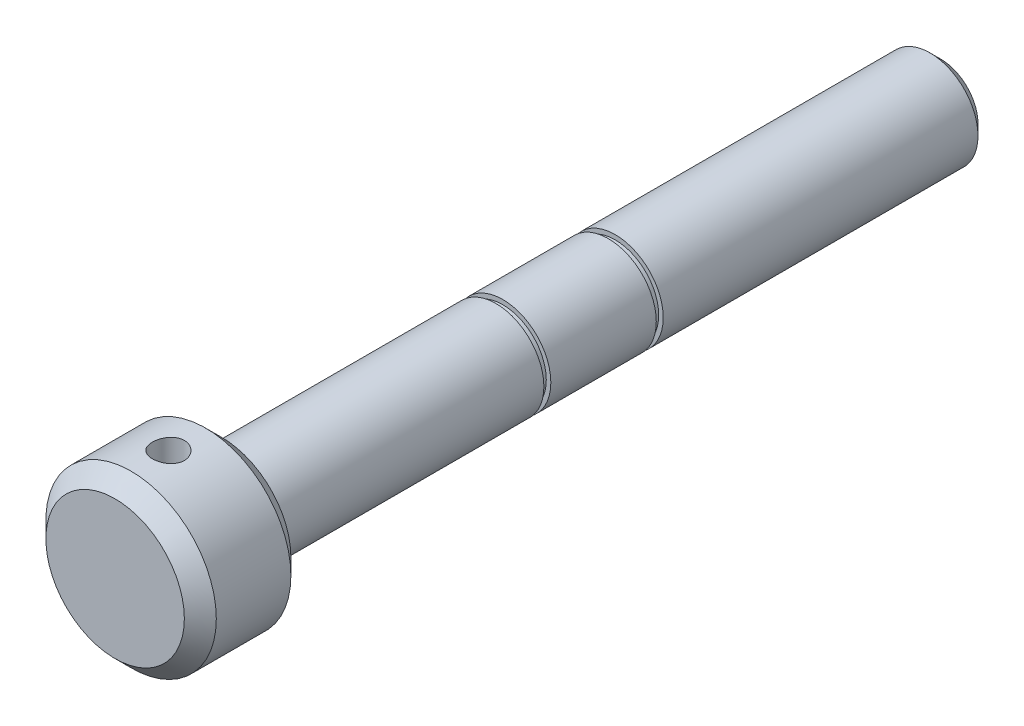
ISO-10303-21;
HEADER;
FILE_DESCRIPTION(('STEP AP214'),'2;1');
FILE_NAME('part.step','',(''),(''),'','','');
FILE_SCHEMA(('AUTOMOTIVE_DESIGN { 1 0 10303 214 1 1 1 1 }'));
ENDSEC;
DATA;
#1=APPLICATION_CONTEXT('core data for automotive mechanical design processes');
#2=APPLICATION_PROTOCOL_DEFINITION('international standard','automotive_design',2000,#1);
#3=PRODUCT_CONTEXT('',#1,'mechanical');
#4=PRODUCT('Part','Part','',(#3));
#5=PRODUCT_RELATED_PRODUCT_CATEGORY('part','',(#4));
#6=PRODUCT_DEFINITION_FORMATION('','',#4);
#7=PRODUCT_DEFINITION_CONTEXT('part definition',#1,'design');
#8=PRODUCT_DEFINITION('design','',#6,#7);
#9=PRODUCT_DEFINITION_SHAPE('','',#8);
#10=(LENGTH_UNIT() NAMED_UNIT(*) SI_UNIT(.MILLI.,.METRE.));
#11=(NAMED_UNIT(*) PLANE_ANGLE_UNIT() SI_UNIT($,.RADIAN.));
#12=(NAMED_UNIT(*) SI_UNIT($,.STERADIAN.) SOLID_ANGLE_UNIT());
#13=UNCERTAINTY_MEASURE_WITH_UNIT(LENGTH_MEASURE(1.E-05),#10,'distance_accuracy_value','');
#14=(GEOMETRIC_REPRESENTATION_CONTEXT(3) GLOBAL_UNCERTAINTY_ASSIGNED_CONTEXT((#13)) GLOBAL_UNIT_ASSIGNED_CONTEXT((#10,
#11,#12)) REPRESENTATION_CONTEXT('',''));
#15=CARTESIAN_POINT('',(0.,0.,0.));
#16=DIRECTION('',(0.,0.,1.));
#17=DIRECTION('',(1.,0.,0.));
#18=AXIS2_PLACEMENT_3D('',#15,#16,#17);
#19=CARTESIAN_POINT('',(0.,0.,135.));
#20=DIRECTION('',(0.,0.,-1.));
#21=DIRECTION('',(-1.,0.,0.));
#22=AXIS2_PLACEMENT_3D('',#19,#20,#21);
#23=CYLINDRICAL_SURFACE('',#22,9.);
#24=CARTESIAN_POINT('',(0.,0.,82.2));
#25=DIRECTION('',(0.,0.,1.));
#26=DIRECTION('',(1.,0.,0.));
#27=AXIS2_PLACEMENT_3D('',#24,#25,#26);
#28=CIRCLE('',#27,9.);
#29=CARTESIAN_POINT('',(9.,0.,82.2));
#30=VERTEX_POINT('',#29);
#31=EDGE_CURVE('E159',#30,#30,#28,.T.);
#32=ORIENTED_EDGE('',*,*,#31,.F.);
#33=EDGE_LOOP('',(#32));
#34=FACE_BOUND('',#33,.T.);
#35=CARTESIAN_POINT('',(0.,0.,62.4));
#36=DIRECTION('',(0.,0.,1.));
#37=DIRECTION('',(1.,0.,0.));
#38=AXIS2_PLACEMENT_3D('',#35,#36,#37);
#39=CIRCLE('',#38,9.);
#40=CARTESIAN_POINT('',(9.,0.,62.4));
#41=VERTEX_POINT('',#40);
#42=EDGE_CURVE('E142',#41,#41,#39,.T.);
#43=ORIENTED_EDGE('',*,*,#42,.T.);
#44=EDGE_LOOP('',(#43));
#45=FACE_BOUND('',#44,.T.);
#46=ADVANCED_FACE('F40',(#34,#45),#23,.T.);
#47=CARTESIAN_POINT('',(0.,0.,83.5));
#48=DIRECTION('',(0.,0.,1.));
#49=DIRECTION('',(1.,0.,0.));
#50=AXIS2_PLACEMENT_3D('',#47,#48,#49);
#51=CIRCLE('',#50,9.);
#52=CARTESIAN_POINT('',(9.,0.,83.5));
#53=VERTEX_POINT('',#52);
#54=EDGE_CURVE('E156',#53,#53,#51,.T.);
#55=ORIENTED_EDGE('',*,*,#54,.T.);
#56=EDGE_LOOP('',(#55));
#57=FACE_BOUND('',#56,.T.);
#58=CARTESIAN_POINT('',(0.,0.,135.));
#59=DIRECTION('',(0.,0.,1.));
#60=DIRECTION('',(1.,0.,0.));
#61=AXIS2_PLACEMENT_3D('',#58,#59,#60);
#62=CIRCLE('',#61,9.);
#63=CARTESIAN_POINT('',(9.,0.,135.));
#64=VERTEX_POINT('',#63);
#65=EDGE_CURVE('E67',#64,#64,#62,.T.);
#66=ORIENTED_EDGE('',*,*,#65,.F.);
#67=EDGE_LOOP('',(#66));
#68=FACE_BOUND('',#67,.T.);
#69=ADVANCED_FACE('F121',(#57,#68),#23,.T.);
#70=CARTESIAN_POINT('',(0.,0.,155.));
#71=DIRECTION('',(0.,0.,-1.));
#72=DIRECTION('',(-1.,0.,0.));
#73=AXIS2_PLACEMENT_3D('',#70,#71,#72);
#74=CYLINDRICAL_SURFACE('',#73,16.);
#75=CARTESIAN_POINT('',(0.,0.,152.));
#76=DIRECTION('',(0.,0.,1.));
#77=DIRECTION('',(1.,0.,0.));
#78=AXIS2_PLACEMENT_3D('',#75,#76,#77);
#79=CIRCLE('',#78,16.);
#80=CARTESIAN_POINT('',(16.,0.,152.));
#81=VERTEX_POINT('',#80);
#82=EDGE_CURVE('E56',#81,#81,#79,.F.);
#83=ORIENTED_EDGE('',*,*,#82,.T.);
#84=EDGE_LOOP('',(#83));
#85=FACE_BOUND('',#84,.T.);
#86=CARTESIAN_POINT('',(0.,0.,138.));
#87=DIRECTION('',(0.,0.,1.));
#88=DIRECTION('',(1.,0.,0.));
#89=AXIS2_PLACEMENT_3D('',#86,#87,#88);
#90=CIRCLE('',#89,16.);
#91=CARTESIAN_POINT('',(16.,0.,138.));
#92=VERTEX_POINT('',#91);
#93=EDGE_CURVE('E61',#92,#92,#90,.T.);
#94=ORIENTED_EDGE('',*,*,#93,.T.);
#95=EDGE_LOOP('',(#94));
#96=FACE_BOUND('',#95,.T.);
#97=CARTESIAN_POINT('',(0.,-16.,148.));
#98=CARTESIAN_POINT('',(-0.16694349293094,-15.999996976677,147.999993620823));
#99=CARTESIAN_POINT('',(-0.333969985460195,-15.9973601984343,147.986017846761));
#100=CARTESIAN_POINT('',(-0.663316259683594,-15.9870957178104,147.930520009763));
#101=CARTESIAN_POINT('',(-0.825631948304451,-15.9794638033379,147.888974698721));
#102=CARTESIAN_POINT('',(-1.1407459237036,-15.9600627753092,147.779654597481));
#103=CARTESIAN_POINT('',(-1.29355266137069,-15.9482973989297,147.711903495095));
#104=CARTESIAN_POINT('',(-1.58561594618802,-15.9219142119957,147.552162246154));
#105=CARTESIAN_POINT('',(-1.72487358895465,-15.9072966323658,147.46017406171));
#106=CARTESIAN_POINT('',(-1.98756743186101,-15.8766267286101,147.253400463993));
#107=CARTESIAN_POINT('',(-2.11081791006366,-15.860560697127,147.13838111066));
#108=CARTESIAN_POINT('',(-2.33639212270738,-15.828906369173,146.889313381825));
#109=CARTESIAN_POINT('',(-2.43871435378483,-15.8133181070906,146.755263640461));
#110=CARTESIAN_POINT('',(-2.62029997331586,-15.7842510249001,146.470627823272));
#111=CARTESIAN_POINT('',(-2.6993744393921,-15.7707898777236,146.319919259366));
#112=CARTESIAN_POINT('',(-2.83101048664566,-15.7476942642397,146.007062169646));
#113=CARTESIAN_POINT('',(-2.88357435426196,-15.7380594679392,145.844914631778));
#114=CARTESIAN_POINT('',(-2.96010107007,-15.723845391491,145.515769538171));
#115=CARTESIAN_POINT('',(-2.98438780384078,-15.7192089073281,145.348849805593));
#116=CARTESIAN_POINT('',(-3.00467616190693,-15.7153439430552,145.013245230383));
#117=CARTESIAN_POINT('',(-3.00068032270748,-15.7161149779752,144.844560547395));
#118=CARTESIAN_POINT('',(-2.96477959204725,-15.7229258540351,144.512560949468));
#119=CARTESIAN_POINT('',(-2.9332429999209,-15.7288961629467,144.3492045714));
#120=CARTESIAN_POINT('',(-2.84373598792413,-15.7453236656933,144.030143160435));
#121=CARTESIAN_POINT('',(-2.78576444478998,-15.7557810501903,143.874438452981));
#122=CARTESIAN_POINT('',(-2.64467294358599,-15.7800771058518,143.574022642));
#123=CARTESIAN_POINT('',(-2.56140427064912,-15.7939356764673,143.429383058838));
#124=CARTESIAN_POINT('',(-2.37218737860833,-15.8234594320584,143.15599054292));
#125=CARTESIAN_POINT('',(-2.26623685778532,-15.8391248003104,143.02723922457));
#126=CARTESIAN_POINT('',(-2.03267811370594,-15.8708000254433,142.787150088655));
#127=CARTESIAN_POINT('',(-1.90475487372136,-15.8868114204806,142.676118695097));
#128=CARTESIAN_POINT('',(-1.63193607419765,-15.9171477221664,142.477045518649));
#129=CARTESIAN_POINT('',(-1.48704034451153,-15.9314726119049,142.389003966259));
#130=CARTESIAN_POINT('',(-1.18406997774933,-15.9568507935502,142.23836449226));
#131=CARTESIAN_POINT('',(-1.02597912889298,-15.9678999827258,142.175798441764));
#132=CARTESIAN_POINT('',(-0.701278230797389,-15.9854501080544,142.078195813816));
#133=CARTESIAN_POINT('',(-0.534669088555569,-15.9919515273599,142.043156311909));
#134=CARTESIAN_POINT('',(-0.200297305806765,-15.9996072128396,142.002027937963));
#135=CARTESIAN_POINT('',(-0.0325880252682653,-16.0008390182456,141.995519216941));
#136=CARTESIAN_POINT('',(0.301522496184373,-15.9980308719646,142.010510959095));
#137=CARTESIAN_POINT('',(0.467923800960776,-15.9939911792886,142.032010046131));
#138=CARTESIAN_POINT('',(0.79336314643644,-15.9811422300081,142.102058070367));
#139=CARTESIAN_POINT('',(0.952448522092133,-15.9723704474806,142.150394565076));
#140=CARTESIAN_POINT('',(1.26025726364927,-15.95103684425,142.272515413558));
#141=CARTESIAN_POINT('',(1.40897992519021,-15.9384747662267,142.346301495132));
#142=CARTESIAN_POINT('',(1.69363334302643,-15.9107606071533,142.518156256319));
#143=CARTESIAN_POINT('',(1.82940655403024,-15.8955817234913,142.616481477074));
#144=CARTESIAN_POINT('',(2.08267664652909,-15.8643868697942,142.834276274725));
#145=CARTESIAN_POINT('',(2.20017181952174,-15.8483708216937,142.953747826003));
#146=CARTESIAN_POINT('',(2.41514591744097,-15.817049513949,143.212344637823));
#147=CARTESIAN_POINT('',(2.51233832437154,-15.8017565172051,143.351709816251));
#148=CARTESIAN_POINT('',(2.68193350115575,-15.7738597115706,143.645035249048));
#149=CARTESIAN_POINT('',(2.75433719227849,-15.761255802747,143.798994960741));
#150=CARTESIAN_POINT('',(2.87189347025647,-15.7402604841915,144.116411734485));
#151=CARTESIAN_POINT('',(2.91717737589573,-15.7318488087376,144.279818759119));
#152=CARTESIAN_POINT('',(2.97961358652471,-15.7201440760483,144.612094445043));
#153=CARTESIAN_POINT('',(2.99676906541417,-15.7168504413158,144.780962487941));
#154=CARTESIAN_POINT('',(3.00235524296709,-15.7157839960771,145.116496662883));
#155=CARTESIAN_POINT('',(2.99123790006998,-15.7179243194859,145.283155161914));
#156=CARTESIAN_POINT('',(2.94158350757606,-15.7272920132,145.612182844091));
#157=CARTESIAN_POINT('',(2.90304662178664,-15.7345193531149,145.774552052855));
#158=CARTESIAN_POINT('',(2.79983775166527,-15.7532101604636,146.090148969591));
#159=CARTESIAN_POINT('',(2.73521470794505,-15.7646656918993,146.243393182692));
#160=CARTESIAN_POINT('',(2.58171737824409,-15.7905277510368,146.536936508482));
#161=CARTESIAN_POINT('',(2.49284137896371,-15.8049344872024,146.67723470569));
#162=CARTESIAN_POINT('',(2.2917897467907,-15.8353453221549,146.943167360085));
#163=CARTESIAN_POINT('',(2.17928519728608,-15.8513701070609,147.068550825134));
#164=CARTESIAN_POINT('',(1.93485585348459,-15.8830566783747,147.298810324929));
#165=CARTESIAN_POINT('',(1.80292660378324,-15.8987183805466,147.40368164196));
#166=CARTESIAN_POINT('',(1.52196989014375,-15.928079519361,147.590821905254));
#167=CARTESIAN_POINT('',(1.37279918128104,-15.9417600198112,147.672878856981));
#168=CARTESIAN_POINT('',(1.06258022730767,-15.9654323876137,147.81063527321));
#169=CARTESIAN_POINT('',(0.901543303410488,-15.9754277175807,147.866359494094));
#170=CARTESIAN_POINT('',(0.616694405650299,-15.9885658141526,147.938554628837));
#171=CARTESIAN_POINT('',(0.494547620503736,-15.9928294175641,147.961557260626));
#172=CARTESIAN_POINT('',(0.248282494230315,-15.9985475990802,147.992282124233));
#173=CARTESIAN_POINT('',(0.124164203305419,-16.0000022485961,148.000004744512));
#174=CARTESIAN_POINT('',(0.,-16.,148.));
#175=B_SPLINE_CURVE_WITH_KNOTS('',3,(#97,#98,#99,#100,#101,#102,#103,#104,#105,#106,#107,#108,
#109,#110,#111,#112,#113,#114,#115,#116,#117,#118,#119,#120,#121,#122,#123,#124,#125,#126,#127,
#128,#129,#130,#131,#132,#133,#134,#135,#136,#137,#138,#139,#140,#141,#142,#143,#144,#145,#146,
#147,#148,#149,#150,#151,#152,#153,#154,#155,#156,#157,#158,#159,#160,#161,#162,#163,#164,#165,
#166,#167,#168,#169,#170,#171,#172,#173,#174),.UNSPECIFIED.,.T.,.F.,(4,2,2,2,2,2,2,2,2,2,2,2,2,
2,2,2,2,2,2,2,2,2,2,2,2,2,2,2,2,2,2,2,2,2,2,2,2,2,4),(0.,0.50037640192985,1.0011752850709,
1.50152254246182,2.00182930673782,2.50750236027261,3.01321172567233,3.52292381008716,
4.03259192623897,4.53636302890673,5.04008895174512,5.53718001225534,6.03429219693573,
6.5343852525906,7.0345290809972,7.54255536928154,8.05058675089895,8.55925176643398,
9.06786273347491,9.56896348152194,10.0700396092917,10.5672046781566,11.0644035067606,
11.5670355603542,12.069714568262,12.579068739746,13.0884039790989,13.5952525563712,
14.1020439389303,14.600785044635,15.0995231708301,15.5973299241539,16.0951718531085,
16.6004673993276,17.1058790252451,17.6158409783263,18.1253225386235,18.4974868904882,
18.8696417807908),.UNSPECIFIED.);
#176=CARTESIAN_POINT('',(0.,-16.,148.));
#177=VERTEX_POINT('',#176);
#178=EDGE_CURVE('E70',#177,#177,#175,.T.);
#179=ORIENTED_EDGE('',*,*,#178,.F.);
#180=EDGE_LOOP('',(#179));
#181=FACE_BOUND('',#180,.T.);
#182=CARTESIAN_POINT('',(0.,16.,148.));
#183=CARTESIAN_POINT('',(0.166943492930942,15.999996976677,147.999993620823));
#184=CARTESIAN_POINT('',(0.333969985460198,15.9973601984343,147.986017846761));
#185=CARTESIAN_POINT('',(0.663316259683597,15.9870957178104,147.930520009763));
#186=CARTESIAN_POINT('',(0.825631948304452,15.9794638033379,147.888974698721));
#187=CARTESIAN_POINT('',(1.1407459237036,15.9600627753092,147.779654597481));
#188=CARTESIAN_POINT('',(1.29355266137069,15.9482973989297,147.711903495095));
#189=CARTESIAN_POINT('',(1.58561594618802,15.9219142119957,147.552162246154));
#190=CARTESIAN_POINT('',(1.72487358895465,15.9072966323658,147.46017406171));
#191=CARTESIAN_POINT('',(1.98756743186101,15.8766267286101,147.253400463993));
#192=CARTESIAN_POINT('',(2.11081791006367,15.860560697127,147.13838111066));
#193=CARTESIAN_POINT('',(2.33639212270738,15.828906369173,146.889313381825));
#194=CARTESIAN_POINT('',(2.43871435378483,15.8133181070906,146.755263640461));
#195=CARTESIAN_POINT('',(2.62029997331586,15.7842510249001,146.470627823272));
#196=CARTESIAN_POINT('',(2.69937443939211,15.7707898777236,146.319919259366));
#197=CARTESIAN_POINT('',(2.83101048664566,15.7476942642397,146.007062169646));
#198=CARTESIAN_POINT('',(2.88357435426196,15.7380594679392,145.844914631778));
#199=CARTESIAN_POINT('',(2.96010107007001,15.723845391491,145.515769538171));
#200=CARTESIAN_POINT('',(2.98438780384078,15.7192089073281,145.348849805593));
#201=CARTESIAN_POINT('',(3.00467616190693,15.7153439430552,145.013245230383));
#202=CARTESIAN_POINT('',(3.00068032270748,15.7161149779752,144.844560547395));
#203=CARTESIAN_POINT('',(2.96477959204725,15.7229258540351,144.512560949468));
#204=CARTESIAN_POINT('',(2.9332429999209,15.7288961629467,144.3492045714));
#205=CARTESIAN_POINT('',(2.84373598792414,15.7453236656933,144.030143160435));
#206=CARTESIAN_POINT('',(2.78576444478998,15.7557810501903,143.874438452981));
#207=CARTESIAN_POINT('',(2.644672943586,15.7800771058518,143.574022642));
#208=CARTESIAN_POINT('',(2.56140427064912,15.7939356764673,143.429383058838));
#209=CARTESIAN_POINT('',(2.37218737860833,15.8234594320584,143.15599054292));
#210=CARTESIAN_POINT('',(2.26623685778532,15.8391248003104,143.02723922457));
#211=CARTESIAN_POINT('',(2.03267811370595,15.8708000254433,142.787150088655));
#212=CARTESIAN_POINT('',(1.90475487372136,15.8868114204806,142.676118695097));
#213=CARTESIAN_POINT('',(1.63193607419765,15.9171477221664,142.477045518649));
#214=CARTESIAN_POINT('',(1.48704034451154,15.9314726119049,142.389003966259));
#215=CARTESIAN_POINT('',(1.18406997774934,15.9568507935502,142.23836449226));
#216=CARTESIAN_POINT('',(1.02597912889299,15.9678999827258,142.175798441764));
#217=CARTESIAN_POINT('',(0.701278230797392,15.9854501080544,142.078195813816));
#218=CARTESIAN_POINT('',(0.534669088555572,15.9919515273599,142.043156311909));
#219=CARTESIAN_POINT('',(0.200297305806769,15.9996072128396,142.002027937963));
#220=CARTESIAN_POINT('',(0.0325880252682696,16.0008390182456,141.995519216941));
#221=CARTESIAN_POINT('',(-0.301522496184369,15.9980308719646,142.010510959095));
#222=CARTESIAN_POINT('',(-0.467923800960772,15.9939911792886,142.032010046131));
#223=CARTESIAN_POINT('',(-0.793363146436436,15.9811422300081,142.102058070367));
#224=CARTESIAN_POINT('',(-0.952448522092129,15.9723704474806,142.150394565076));
#225=CARTESIAN_POINT('',(-1.26025726364927,15.95103684425,142.272515413558));
#226=CARTESIAN_POINT('',(-1.40897992519021,15.9384747662267,142.346301495132));
#227=CARTESIAN_POINT('',(-1.69363334302643,15.9107606071533,142.518156256319));
#228=CARTESIAN_POINT('',(-1.82940655403024,15.8955817234913,142.616481477074));
#229=CARTESIAN_POINT('',(-2.08267664652909,15.8643868697942,142.834276274725));
#230=CARTESIAN_POINT('',(-2.20017181952173,15.8483708216937,142.953747826003));
#231=CARTESIAN_POINT('',(-2.41514591744096,15.817049513949,143.212344637823));
#232=CARTESIAN_POINT('',(-2.51233832437154,15.8017565172051,143.351709816251));
#233=CARTESIAN_POINT('',(-2.68193350115574,15.7738597115706,143.645035249048));
#234=CARTESIAN_POINT('',(-2.75433719227849,15.761255802747,143.798994960741));
#235=CARTESIAN_POINT('',(-2.87189347025646,15.7402604841915,144.116411734485));
#236=CARTESIAN_POINT('',(-2.91717737589573,15.7318488087376,144.279818759119));
#237=CARTESIAN_POINT('',(-2.97961358652471,15.7201440760483,144.612094445043));
#238=CARTESIAN_POINT('',(-2.99676906541416,15.7168504413158,144.780962487941));
#239=CARTESIAN_POINT('',(-3.00235524296709,15.7157839960771,145.116496662883));
#240=CARTESIAN_POINT('',(-2.99123790006998,15.7179243194859,145.283155161914));
#241=CARTESIAN_POINT('',(-2.94158350757606,15.7272920132,145.612182844091));
#242=CARTESIAN_POINT('',(-2.90304662178664,15.7345193531149,145.774552052855));
#243=CARTESIAN_POINT('',(-2.79983775166527,15.7532101604636,146.090148969591));
#244=CARTESIAN_POINT('',(-2.73521470794506,15.7646656918993,146.243393182692));
#245=CARTESIAN_POINT('',(-2.5817173782441,15.7905277510368,146.536936508482));
#246=CARTESIAN_POINT('',(-2.49284137896373,15.8049344872024,146.67723470569));
#247=CARTESIAN_POINT('',(-2.29178974679072,15.8353453221549,146.943167360085));
#248=CARTESIAN_POINT('',(-2.17928519728608,15.8513701070609,147.068550825134));
#249=CARTESIAN_POINT('',(-1.93485585348459,15.8830566783747,147.298810324929));
#250=CARTESIAN_POINT('',(-1.80292660378324,15.8987183805466,147.40368164196));
#251=CARTESIAN_POINT('',(-1.52196989014375,15.928079519361,147.590821905254));
#252=CARTESIAN_POINT('',(-1.37279918128104,15.9417600198112,147.672878856981));
#253=CARTESIAN_POINT('',(-1.06258022730766,15.9654323876137,147.81063527321));
#254=CARTESIAN_POINT('',(-0.901543303410486,15.9754277175807,147.866359494094));
#255=CARTESIAN_POINT('',(-0.616694405650296,15.9885658141526,147.938554628837));
#256=CARTESIAN_POINT('',(-0.494547620503732,15.9928294175641,147.961557260626));
#257=CARTESIAN_POINT('',(-0.248282494230311,15.9985475990802,147.992282124233));
#258=CARTESIAN_POINT('',(-0.124164203305417,16.0000022485961,148.000004744512));
#259=CARTESIAN_POINT('',(0.,16.,148.));
#260=B_SPLINE_CURVE_WITH_KNOTS('',3,(#182,#183,#184,#185,#186,#187,#188,#189,#190,#191,#192,
#193,#194,#195,#196,#197,#198,#199,#200,#201,#202,#203,#204,#205,#206,#207,#208,#209,#210,#211,
#212,#213,#214,#215,#216,#217,#218,#219,#220,#221,#222,#223,#224,#225,#226,#227,#228,#229,#230,
#231,#232,#233,#234,#235,#236,#237,#238,#239,#240,#241,#242,#243,#244,#245,#246,#247,#248,#249,
#250,#251,#252,#253,#254,#255,#256,#257,#258,#259),.UNSPECIFIED.,.T.,.F.,(4,2,2,2,2,2,2,2,2,2,2,
2,2,2,2,2,2,2,2,2,2,2,2,2,2,2,2,2,2,2,2,2,2,2,2,2,2,2,4),(0.,0.500376401929847,1.00117528507091,
1.50152254246182,2.00182930673782,2.50750236027261,3.01321172567234,3.52292381008716,
4.03259192623897,4.53636302890673,5.04008895174513,5.53718001225534,6.03429219693574,
6.53438525259061,7.0345290809972,7.54255536928154,8.05058675089896,8.55925176643399,
9.06786273347492,9.56896348152194,10.0700396092917,10.5672046781566,11.0644035067606,
11.5670355603542,12.069714568262,12.579068739746,13.0884039790989,13.5952525563712,
14.1020439389303,14.600785044635,15.0995231708301,15.5973299241538,16.0951718531084,
16.6004673993276,17.1058790252451,17.6158409783263,18.1253225386235,18.4974868904882,
18.8696417807908),.UNSPECIFIED.);
#261=CARTESIAN_POINT('',(0.,16.,148.));
#262=VERTEX_POINT('',#261);
#263=EDGE_CURVE('E78',#262,#262,#260,.T.);
#264=ORIENTED_EDGE('',*,*,#263,.F.);
#265=EDGE_LOOP('',(#264));
#266=FACE_BOUND('',#265,.T.);
#267=ADVANCED_FACE('F128',(#85,#96,#181,#266),#74,.T.);
#268=CARTESIAN_POINT('',(0.,0.,155.));
#269=DIRECTION('',(0.,0.,1.));
#270=DIRECTION('',(1.,0.,0.));
#271=AXIS2_PLACEMENT_3D('',#268,#269,#270);
#272=PLANE('',#271);
#273=CARTESIAN_POINT('',(0.,0.,155.));
#274=DIRECTION('',(0.,0.,1.));
#275=DIRECTION('',(1.,0.,0.));
#276=AXIS2_PLACEMENT_3D('',#273,#274,#275);
#277=CIRCLE('',#276,13.);
#278=CARTESIAN_POINT('',(13.,0.,155.));
#279=VERTEX_POINT('',#278);
#280=EDGE_CURVE('E64',#279,#279,#277,.T.);
#281=ORIENTED_EDGE('',*,*,#280,.T.);
#282=EDGE_LOOP('',(#281));
#283=FACE_BOUND('',#282,.T.);
#284=ADVANCED_FACE('F169',(#283),#272,.T.);
#285=CARTESIAN_POINT('',(0.,0.,135.));
#286=DIRECTION('',(0.,0.,1.));
#287=DIRECTION('',(1.,0.,0.));
#288=AXIS2_PLACEMENT_3D('',#285,#286,#287);
#289=PLANE('',#288);
#290=CARTESIAN_POINT('',(0.,0.,135.));
#291=DIRECTION('',(0.,0.,1.));
#292=DIRECTION('',(1.,0.,0.));
#293=AXIS2_PLACEMENT_3D('',#290,#291,#292);
#294=CIRCLE('',#293,13.);
#295=CARTESIAN_POINT('',(13.,0.,135.));
#296=VERTEX_POINT('',#295);
#297=EDGE_CURVE('E52',#296,#296,#294,.F.);
#298=ORIENTED_EDGE('',*,*,#297,.T.);
#299=EDGE_LOOP('',(#298));
#300=FACE_BOUND('',#299,.T.);
#301=ORIENTED_EDGE('',*,*,#65,.T.);
#302=EDGE_LOOP('',(#301));
#303=FACE_BOUND('',#302,.T.);
#304=ADVANCED_FACE('F167',(#300,#303),#289,.F.);
#305=CARTESIAN_POINT('',(0.,-16.001,145.));
#306=DIRECTION('',(0.,1.,0.));
#307=DIRECTION('',(0.,0.,1.));
#308=AXIS2_PLACEMENT_3D('',#305,#306,#307);
#309=CYLINDRICAL_SURFACE('',#308,3.);
#310=ORIENTED_EDGE('',*,*,#178,.T.);
#311=EDGE_LOOP('',(#310));
#312=FACE_BOUND('',#311,.T.);
#313=ORIENTED_EDGE('',*,*,#263,.T.);
#314=EDGE_LOOP('',(#313));
#315=FACE_BOUND('',#314,.T.);
#316=ADVANCED_FACE('F83',(#312,#315),#309,.F.);
#317=CARTESIAN_POINT('',(0.,0.,155.));
#318=DIRECTION('',(0.,0.,-1.));
#319=DIRECTION('',(-1.,0.,0.));
#320=AXIS2_PLACEMENT_3D('',#317,#318,#319);
#321=CONICAL_SURFACE('',#320,13.,0.785398163397437);
#322=ORIENTED_EDGE('',*,*,#82,.F.);
#323=EDGE_LOOP('',(#322));
#324=FACE_BOUND('',#323,.T.);
#325=ORIENTED_EDGE('',*,*,#280,.F.);
#326=EDGE_LOOP('',(#325));
#327=FACE_BOUND('',#326,.T.);
#328=ADVANCED_FACE('F176',(#324,#327),#321,.T.);
#329=CARTESIAN_POINT('',(0.,0.,138.));
#330=DIRECTION('',(0.,0.,1.));
#331=DIRECTION('',(1.,0.,0.));
#332=AXIS2_PLACEMENT_3D('',#329,#330,#331);
#333=CONICAL_SURFACE('',#332,16.,0.785398163397446);
#334=ORIENTED_EDGE('',*,*,#297,.F.);
#335=EDGE_LOOP('',(#334));
#336=FACE_BOUND('',#335,.T.);
#337=ORIENTED_EDGE('',*,*,#93,.F.);
#338=EDGE_LOOP('',(#337));
#339=FACE_BOUND('',#338,.T.);
#340=ADVANCED_FACE('F97',(#336,#339),#333,.T.);
#341=CARTESIAN_POINT('',(0.,0.,82.2));
#342=DIRECTION('',(0.,0.,1.));
#343=DIRECTION('',(1.,0.,0.));
#344=AXIS2_PLACEMENT_3D('',#341,#342,#343);
#345=PLANE('',#344);
#346=CARTESIAN_POINT('',(0.,0.,82.2));
#347=DIRECTION('',(0.,0.,1.));
#348=DIRECTION('',(1.,0.,0.));
#349=AXIS2_PLACEMENT_3D('',#346,#347,#348);
#350=CIRCLE('',#349,8.15);
#351=CARTESIAN_POINT('',(8.15,0.,82.2));
#352=VERTEX_POINT('',#351);
#353=EDGE_CURVE('E153',#352,#352,#350,.T.);
#354=ORIENTED_EDGE('',*,*,#353,.F.);
#355=EDGE_LOOP('',(#354));
#356=FACE_BOUND('',#355,.T.);
#357=ORIENTED_EDGE('',*,*,#31,.T.);
#358=EDGE_LOOP('',(#357));
#359=FACE_BOUND('',#358,.T.);
#360=ADVANCED_FACE('F93',(#356,#359),#345,.T.);
#361=CARTESIAN_POINT('',(0.,0.,83.5));
#362=DIRECTION('',(0.,0.,1.));
#363=DIRECTION('',(1.,0.,0.));
#364=AXIS2_PLACEMENT_3D('',#361,#362,#363);
#365=PLANE('',#364);
#366=CARTESIAN_POINT('',(0.,0.,83.5));
#367=DIRECTION('',(0.,0.,1.));
#368=DIRECTION('',(1.,0.,0.));
#369=AXIS2_PLACEMENT_3D('',#366,#367,#368);
#370=CIRCLE('',#369,8.15);
#371=CARTESIAN_POINT('',(8.15,0.,83.5));
#372=VERTEX_POINT('',#371);
#373=EDGE_CURVE('E146',#372,#372,#370,.T.);
#374=ORIENTED_EDGE('',*,*,#373,.T.);
#375=EDGE_LOOP('',(#374));
#376=FACE_BOUND('',#375,.T.);
#377=ORIENTED_EDGE('',*,*,#54,.F.);
#378=EDGE_LOOP('',(#377));
#379=FACE_BOUND('',#378,.T.);
#380=ADVANCED_FACE('F88',(#376,#379),#365,.F.);
#381=CARTESIAN_POINT('',(0.,0.,82.2));
#382=DIRECTION('',(0.,0.,1.));
#383=DIRECTION('',(1.,0.,0.));
#384=AXIS2_PLACEMENT_3D('',#381,#382,#383);
#385=CYLINDRICAL_SURFACE('',#384,8.15);
#386=ORIENTED_EDGE('',*,*,#353,.T.);
#387=EDGE_LOOP('',(#386));
#388=FACE_BOUND('',#387,.T.);
#389=ORIENTED_EDGE('',*,*,#373,.F.);
#390=EDGE_LOOP('',(#389));
#391=FACE_BOUND('',#390,.T.);
#392=ADVANCED_FACE('F92',(#388,#391),#385,.T.);
#393=CARTESIAN_POINT('',(0.,0.,62.4));
#394=DIRECTION('',(0.,0.,-1.));
#395=DIRECTION('',(1.,0.,0.));
#396=AXIS2_PLACEMENT_3D('',#393,#394,#395);
#397=PLANE('',#396);
#398=ORIENTED_EDGE('',*,*,#42,.F.);
#399=EDGE_LOOP('',(#398));
#400=FACE_BOUND('',#399,.T.);
#401=CARTESIAN_POINT('',(0.,0.,62.4));
#402=DIRECTION('',(0.,0.,1.));
#403=DIRECTION('',(1.,0.,0.));
#404=AXIS2_PLACEMENT_3D('',#401,#402,#403);
#405=CIRCLE('',#404,8.15);
#406=CARTESIAN_POINT('',(8.15,0.,62.4));
#407=VERTEX_POINT('',#406);
#408=EDGE_CURVE('E143',#407,#407,#405,.T.);
#409=ORIENTED_EDGE('',*,*,#408,.T.);
#410=EDGE_LOOP('',(#409));
#411=FACE_BOUND('',#410,.T.);
#412=ADVANCED_FACE('F101',(#400,#411),#397,.T.);
#413=CARTESIAN_POINT('',(0.,0.,61.1));
#414=DIRECTION('',(0.,0.,-1.));
#415=DIRECTION('',(1.,0.,0.));
#416=AXIS2_PLACEMENT_3D('',#413,#414,#415);
#417=PLANE('',#416);
#418=CARTESIAN_POINT('',(0.,0.,61.1));
#419=DIRECTION('',(0.,0.,1.));
#420=DIRECTION('',(1.,0.,0.));
#421=AXIS2_PLACEMENT_3D('',#418,#419,#420);
#422=CIRCLE('',#421,9.);
#423=CARTESIAN_POINT('',(9.,0.,61.1));
#424=VERTEX_POINT('',#423);
#425=EDGE_CURVE('E141',#424,#424,#422,.T.);
#426=ORIENTED_EDGE('',*,*,#425,.T.);
#427=EDGE_LOOP('',(#426));
#428=FACE_BOUND('',#427,.T.);
#429=CARTESIAN_POINT('',(0.,0.,61.1));
#430=DIRECTION('',(0.,0.,1.));
#431=DIRECTION('',(1.,0.,0.));
#432=AXIS2_PLACEMENT_3D('',#429,#430,#431);
#433=CIRCLE('',#432,8.15);
#434=CARTESIAN_POINT('',(8.15,0.,61.1));
#435=VERTEX_POINT('',#434);
#436=EDGE_CURVE('E149',#435,#435,#433,.T.);
#437=ORIENTED_EDGE('',*,*,#436,.F.);
#438=EDGE_LOOP('',(#437));
#439=FACE_BOUND('',#438,.T.);
#440=ADVANCED_FACE('F103',(#428,#439),#417,.F.);
#441=CARTESIAN_POINT('',(0.,0.,62.4));
#442=DIRECTION('',(0.,0.,-1.));
#443=DIRECTION('',(-1.,0.,0.));
#444=AXIS2_PLACEMENT_3D('',#441,#442,#443);
#445=CYLINDRICAL_SURFACE('',#444,8.15);
#446=ORIENTED_EDGE('',*,*,#408,.F.);
#447=EDGE_LOOP('',(#446));
#448=FACE_BOUND('',#447,.T.);
#449=ORIENTED_EDGE('',*,*,#436,.T.);
#450=EDGE_LOOP('',(#449));
#451=FACE_BOUND('',#450,.T.);
#452=ADVANCED_FACE('F106',(#448,#451),#445,.T.);
#453=CARTESIAN_POINT('',(0.,0.,0.));
#454=DIRECTION('',(0.,0.,1.));
#455=DIRECTION('',(1.,0.,0.));
#456=AXIS2_PLACEMENT_3D('',#453,#454,#455);
#457=PLANE('',#456);
#458=CARTESIAN_POINT('',(0.,0.,0.));
#459=DIRECTION('',(0.,0.,1.));
#460=DIRECTION('',(1.,0.,0.));
#461=AXIS2_PLACEMENT_3D('',#458,#459,#460);
#462=CIRCLE('',#461,6.99999999999992);
#463=CARTESIAN_POINT('',(6.99999999999992,0.,0.));
#464=VERTEX_POINT('',#463);
#465=EDGE_CURVE('E10',#464,#464,#462,.F.);
#466=ORIENTED_EDGE('',*,*,#465,.T.);
#467=EDGE_LOOP('',(#466));
#468=FACE_BOUND('',#467,.T.);
#469=ADVANCED_FACE('F112',(#468),#457,.F.);
#470=CARTESIAN_POINT('',(0.,0.,2.00000000000006));
#471=DIRECTION('',(0.,0.,1.));
#472=DIRECTION('',(1.,0.,0.));
#473=AXIS2_PLACEMENT_3D('',#470,#471,#472);
#474=CONICAL_SURFACE('',#473,9.,0.785398163397453);
#475=ORIENTED_EDGE('',*,*,#465,.F.);
#476=EDGE_LOOP('',(#475));
#477=FACE_BOUND('',#476,.T.);
#478=CARTESIAN_POINT('',(0.,0.,2.00000000000006));
#479=DIRECTION('',(0.,0.,1.));
#480=DIRECTION('',(1.,0.,0.));
#481=AXIS2_PLACEMENT_3D('',#478,#479,#480);
#482=CIRCLE('',#481,9.);
#483=CARTESIAN_POINT('',(9.,0.,2.00000000000006));
#484=VERTEX_POINT('',#483);
#485=EDGE_CURVE('E48',#484,#484,#482,.T.);
#486=ORIENTED_EDGE('',*,*,#485,.F.);
#487=EDGE_LOOP('',(#486));
#488=FACE_BOUND('',#487,.T.);
#489=ADVANCED_FACE('F43',(#477,#488),#474,.T.);
#490=ORIENTED_EDGE('',*,*,#425,.F.);
#491=EDGE_LOOP('',(#490));
#492=FACE_BOUND('',#491,.T.);
#493=ORIENTED_EDGE('',*,*,#485,.T.);
#494=EDGE_LOOP('',(#493));
#495=FACE_BOUND('',#494,.T.);
#496=ADVANCED_FACE('F124',(#492,#495),#23,.T.);
#497=CLOSED_SHELL('',(#46,#69,#267,#284,#304,#316,#328,#340,#360,#380,#392,#412,#440,#452,#469,
#489,#496));
#498=MANIFOLD_SOLID_BREP('B2',#497);
#499=ADVANCED_BREP_SHAPE_REPRESENTATION('',(#18,#498),#14);
#500=SHAPE_DEFINITION_REPRESENTATION(#9,#499);
ENDSEC;
END-ISO-10303-21;
